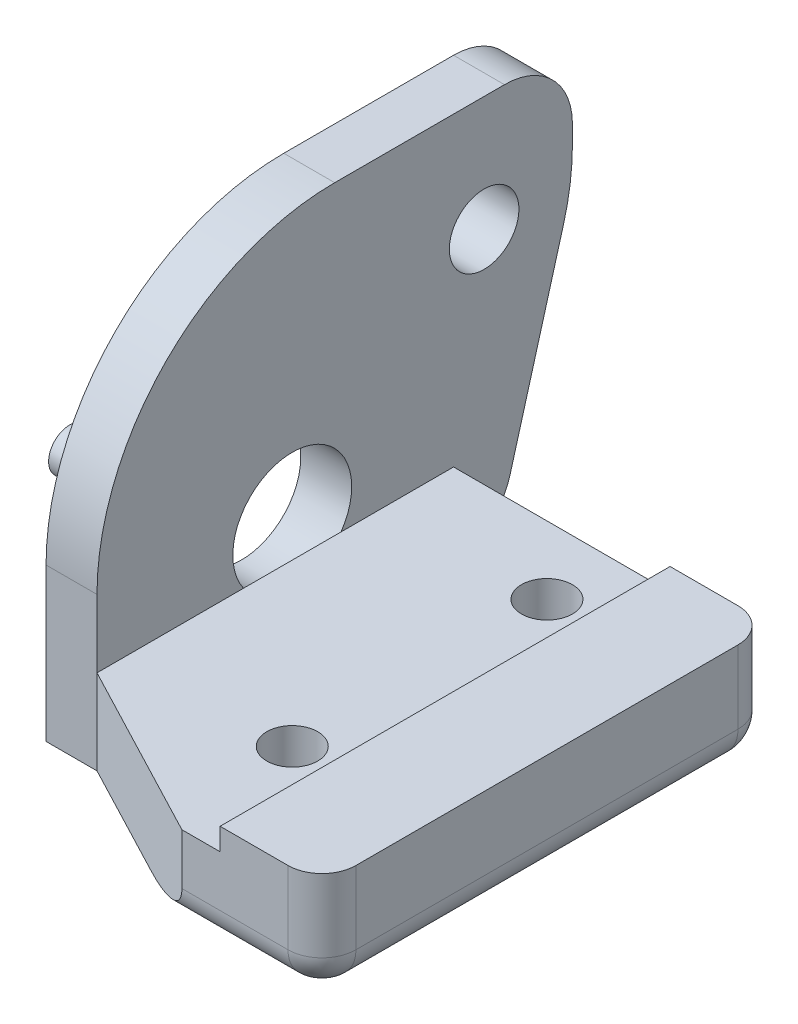
ISO-10303-21;
HEADER;
FILE_DESCRIPTION(('STEP AP214'),'2;1');
FILE_NAME('part.step','',(''),(''),'','','');
FILE_SCHEMA(('AUTOMOTIVE_DESIGN { 1 0 10303 214 1 1 1 1 }'));
ENDSEC;
DATA;
#1=APPLICATION_CONTEXT('core data for automotive mechanical design processes');
#2=APPLICATION_PROTOCOL_DEFINITION('international standard','automotive_design',2000,#1);
#3=PRODUCT_CONTEXT('',#1,'mechanical');
#4=PRODUCT('Part','Part','',(#3));
#5=PRODUCT_RELATED_PRODUCT_CATEGORY('part','',(#4));
#6=PRODUCT_DEFINITION_FORMATION('','',#4);
#7=PRODUCT_DEFINITION_CONTEXT('part definition',#1,'design');
#8=PRODUCT_DEFINITION('design','',#6,#7);
#9=PRODUCT_DEFINITION_SHAPE('','',#8);
#10=(LENGTH_UNIT() NAMED_UNIT(*) SI_UNIT(.MILLI.,.METRE.));
#11=(NAMED_UNIT(*) PLANE_ANGLE_UNIT() SI_UNIT($,.RADIAN.));
#12=(NAMED_UNIT(*) SI_UNIT($,.STERADIAN.) SOLID_ANGLE_UNIT());
#13=UNCERTAINTY_MEASURE_WITH_UNIT(LENGTH_MEASURE(1.E-05),#10,'distance_accuracy_value','');
#14=(GEOMETRIC_REPRESENTATION_CONTEXT(3) GLOBAL_UNCERTAINTY_ASSIGNED_CONTEXT((#13)) GLOBAL_UNIT_ASSIGNED_CONTEXT((#10,
#11,#12)) REPRESENTATION_CONTEXT('',''));
#15=CARTESIAN_POINT('',(0.,0.,0.));
#16=DIRECTION('',(0.,0.,1.));
#17=DIRECTION('',(1.,0.,0.));
#18=AXIS2_PLACEMENT_3D('',#15,#16,#17);
#19=CARTESIAN_POINT('',(-21.75,14.,-29.5));
#20=DIRECTION('',(-1.,0.,0.));
#21=DIRECTION('',(0.,0.,1.));
#22=AXIS2_PLACEMENT_3D('',#19,#20,#21);
#23=CYLINDRICAL_SURFACE('',#22,4.);
#24=DIRECTION('',(-1.,0.,0.));
#25=VECTOR('',#24,1.);
#26=CARTESIAN_POINT('',(-21.75,18.,-29.5));
#27=LINE('',#26,#25);
#28=CARTESIAN_POINT('',(-18.75,18.,-29.5));
#29=VERTEX_POINT('',#28);
#30=CARTESIAN_POINT('',(-21.75,18.,-29.5));
#31=VERTEX_POINT('',#30);
#32=EDGE_CURVE('E351',#29,#31,#27,.T.);
#33=ORIENTED_EDGE('',*,*,#32,.F.);
#34=CARTESIAN_POINT('',(-18.75,14.,-29.5));
#35=DIRECTION('',(1.,0.,0.));
#36=DIRECTION('',(0.,0.,-1.));
#37=AXIS2_PLACEMENT_3D('',#34,#35,#36);
#38=CIRCLE('',#37,4.);
#39=CARTESIAN_POINT('',(-18.75,14.,-33.5));
#40=VERTEX_POINT('',#39);
#41=EDGE_CURVE('E42',#40,#29,#38,.T.);
#42=ORIENTED_EDGE('',*,*,#41,.F.);
#43=DIRECTION('',(-1.,0.,0.));
#44=VECTOR('',#43,1.);
#45=CARTESIAN_POINT('',(-21.75,14.,-33.5));
#46=LINE('',#45,#44);
#47=CARTESIAN_POINT('',(-21.75,14.,-33.5));
#48=VERTEX_POINT('',#47);
#49=EDGE_CURVE('E354',#48,#40,#46,.F.);
#50=ORIENTED_EDGE('',*,*,#49,.F.);
#51=CARTESIAN_POINT('',(-21.75,14.,-29.5));
#52=DIRECTION('',(1.,0.,0.));
#53=DIRECTION('',(0.,0.,-1.));
#54=AXIS2_PLACEMENT_3D('',#51,#52,#53);
#55=CIRCLE('',#54,4.);
#56=EDGE_CURVE('E11',#31,#48,#55,.F.);
#57=ORIENTED_EDGE('',*,*,#56,.F.);
#58=EDGE_LOOP('',(#33,#42,#50,#57));
#59=FACE_BOUND('',#58,.T.);
#60=ADVANCED_FACE('F35',(#59),#23,.T.);
#61=CARTESIAN_POINT('',(0.,-5.,0.));
#62=DIRECTION('',(0.,1.,0.));
#63=DIRECTION('',(0.,0.,1.));
#64=AXIS2_PLACEMENT_3D('',#61,#62,#63);
#65=PLANE('',#64);
#66=CARTESIAN_POINT('',(-9.25,-5.,-7.5));
#67=DIRECTION('',(0.,1.,0.));
#68=DIRECTION('',(0.,0.,1.));
#69=AXIS2_PLACEMENT_3D('',#66,#67,#68);
#70=CIRCLE('',#69,1.5);
#71=CARTESIAN_POINT('',(-9.25,-5.,-6.));
#72=VERTEX_POINT('',#71);
#73=EDGE_CURVE('E236',#72,#72,#70,.T.);
#74=ORIENTED_EDGE('',*,*,#73,.T.);
#75=EDGE_LOOP('',(#74));
#76=FACE_BOUND('',#75,.T.);
#77=CARTESIAN_POINT('',(-9.25,-5.,-22.5));
#78=DIRECTION('',(0.,1.,0.));
#79=DIRECTION('',(0.,0.,1.));
#80=AXIS2_PLACEMENT_3D('',#77,#78,#79);
#81=CIRCLE('',#80,1.5);
#82=CARTESIAN_POINT('',(-9.25,-5.,-21.));
#83=VERTEX_POINT('',#82);
#84=EDGE_CURVE('E239',#83,#83,#81,.T.);
#85=ORIENTED_EDGE('',*,*,#84,.T.);
#86=EDGE_LOOP('',(#85));
#87=FACE_BOUND('',#86,.T.);
#88=DIRECTION('',(1.,0.,0.));
#89=VECTOR('',#88,1.);
#90=CARTESIAN_POINT('',(-21.75,-5.,-25.9698074653513));
#91=LINE('',#90,#89);
#92=CARTESIAN_POINT('',(-21.75,-5.,-25.9698074653513));
#93=VERTEX_POINT('',#92);
#94=CARTESIAN_POINT('',(-18.75,-5.,-25.9698074653513));
#95=VERTEX_POINT('',#94);
#96=EDGE_CURVE('E195',#93,#95,#91,.T.);
#97=ORIENTED_EDGE('',*,*,#96,.T.);
#98=DIRECTION('',(0.,0.,1.));
#99=VECTOR('',#98,1.);
#100=CARTESIAN_POINT('',(-18.75,-5.,-5.49999999999999));
#101=LINE('',#100,#99);
#102=CARTESIAN_POINT('',(-18.75,-5.,-24.5));
#103=VERTEX_POINT('',#102);
#104=EDGE_CURVE('E254',#95,#103,#101,.T.);
#105=ORIENTED_EDGE('',*,*,#104,.T.);
#106=DIRECTION('',(-1.,0.,0.));
#107=VECTOR('',#106,1.);
#108=CARTESIAN_POINT('',(0.,-5.,-24.5));
#109=LINE('',#108,#107);
#110=CARTESIAN_POINT('',(-2.,-5.,-24.5));
#111=VERTEX_POINT('',#110);
#112=EDGE_CURVE('E301',#103,#111,#109,.F.);
#113=ORIENTED_EDGE('',*,*,#112,.T.);
#114=DIRECTION('',(0.,0.,-1.));
#115=VECTOR('',#114,1.);
#116=CARTESIAN_POINT('',(-2.,-5.,0.));
#117=LINE('',#116,#115);
#118=CARTESIAN_POINT('',(-2.,-5.,-2.));
#119=VERTEX_POINT('',#118);
#120=EDGE_CURVE('E317',#111,#119,#117,.F.);
#121=ORIENTED_EDGE('',*,*,#120,.T.);
#122=DIRECTION('',(1.,0.,0.));
#123=VECTOR('',#122,1.);
#124=CARTESIAN_POINT('',(0.,-5.,-2.));
#125=LINE('',#124,#123);
#126=CARTESIAN_POINT('',(-12.0681818181818,-5.,-2.));
#127=VERTEX_POINT('',#126);
#128=EDGE_CURVE('E320',#119,#127,#125,.F.);
#129=ORIENTED_EDGE('',*,*,#128,.T.);
#130=DIRECTION('',(0.885831535280156,0.,0.464006994670557));
#131=VECTOR('',#130,1.);
#132=CARTESIAN_POINT('',(-8.25,-5.,0.));
#133=LINE('',#132,#131);
#134=CARTESIAN_POINT('',(-18.75,-5.,-5.49999999999999));
#135=VERTEX_POINT('',#134);
#136=EDGE_CURVE('E267',#135,#127,#133,.T.);
#137=ORIENTED_EDGE('',*,*,#136,.F.);
#138=DIRECTION('',(1.,0.,0.));
#139=VECTOR('',#138,1.);
#140=CARTESIAN_POINT('',(-21.75,-5.,-5.49999999999999));
#141=LINE('',#140,#139);
#142=CARTESIAN_POINT('',(-21.75,-5.,-5.49999999999999));
#143=VERTEX_POINT('',#142);
#144=EDGE_CURVE('E257',#143,#135,#141,.T.);
#145=ORIENTED_EDGE('',*,*,#144,.F.);
#146=DIRECTION('',(0.,0.,1.));
#147=VECTOR('',#146,1.);
#148=CARTESIAN_POINT('',(-21.75,-5.,-5.49999999999999));
#149=LINE('',#148,#147);
#150=EDGE_CURVE('E177',#93,#143,#149,.T.);
#151=ORIENTED_EDGE('',*,*,#150,.F.);
#152=EDGE_LOOP('',(#97,#105,#113,#121,#129,#137,#145,#151));
#153=FACE_BOUND('',#152,.T.);
#154=ADVANCED_FACE('F406',(#76,#87,#153),#65,.F.);
#155=CARTESIAN_POINT('',(-18.75,0.,0.));
#156=DIRECTION('',(1.,0.,0.));
#157=DIRECTION('',(0.,0.,-1.));
#158=AXIS2_PLACEMENT_3D('',#155,#156,#157);
#159=PLANE('',#158);
#160=DIRECTION('',(0.,-1.,0.));
#161=VECTOR('',#160,1.);
#162=CARTESIAN_POINT('',(-18.75,-5.,-33.5));
#163=LINE('',#162,#161);
#164=CARTESIAN_POINT('',(-18.75,12.9312848756278,-33.5));
#165=VERTEX_POINT('',#164);
#166=EDGE_CURVE('E193',#40,#165,#163,.T.);
#167=ORIENTED_EDGE('',*,*,#166,.F.);
#168=ORIENTED_EDGE('',*,*,#41,.T.);
#169=DIRECTION('',(0.,0.,-1.));
#170=VECTOR('',#169,1.);
#171=CARTESIAN_POINT('',(-18.75,18.,-33.5));
#172=LINE('',#171,#170);
#173=CARTESIAN_POINT('',(-18.75,18.,-19.5));
#174=VERTEX_POINT('',#173);
#175=EDGE_CURVE('E260',#174,#29,#172,.T.);
#176=ORIENTED_EDGE('',*,*,#175,.F.);
#177=CARTESIAN_POINT('',(-18.75,3.99999999999999,-19.5));
#178=DIRECTION('',(1.,0.,0.));
#179=DIRECTION('',(0.,0.,-1.));
#180=AXIS2_PLACEMENT_3D('',#177,#178,#179);
#181=CIRCLE('',#180,14.);
#182=CARTESIAN_POINT('',(-18.75,3.99999999999999,-5.49999999999999));
#183=VERTEX_POINT('',#182);
#184=EDGE_CURVE('E297',#174,#183,#181,.T.);
#185=ORIENTED_EDGE('',*,*,#184,.T.);
#186=DIRECTION('',(0.,1.,0.));
#187=VECTOR('',#186,1.);
#188=CARTESIAN_POINT('',(-18.75,18.,-5.49999999999999));
#189=LINE('',#188,#187);
#190=CARTESIAN_POINT('',(-18.75,0.,-5.49999999999999));
#191=VERTEX_POINT('',#190);
#192=EDGE_CURVE('E242',#191,#183,#189,.T.);
#193=ORIENTED_EDGE('',*,*,#192,.F.);
#194=DIRECTION('',(0.,0.,1.));
#195=VECTOR('',#194,1.);
#196=CARTESIAN_POINT('',(-18.75,0.,-26.5));
#197=LINE('',#196,#195);
#198=CARTESIAN_POINT('',(-18.75,0.,-14.127718676731));
#199=VERTEX_POINT('',#198);
#200=EDGE_CURVE('E275',#199,#191,#197,.T.);
#201=ORIENTED_EDGE('',*,*,#200,.F.);
#202=CARTESIAN_POINT('',(-18.75,2.,-17.));
#203=DIRECTION('',(1.,0.,0.));
#204=DIRECTION('',(0.,0.,-1.));
#205=AXIS2_PLACEMENT_3D('',#202,#203,#204);
#206=CIRCLE('',#205,3.5);
#207=CARTESIAN_POINT('',(-18.75,0.,-19.872281323269));
#208=VERTEX_POINT('',#207);
#209=EDGE_CURVE('E232',#208,#199,#206,.T.);
#210=ORIENTED_EDGE('',*,*,#209,.F.);
#211=CARTESIAN_POINT('',(-18.75,0.,-26.5));
#212=VERTEX_POINT('',#211);
#213=EDGE_CURVE('E276',#212,#208,#197,.T.);
#214=ORIENTED_EDGE('',*,*,#213,.F.);
#215=DIRECTION('',(0.,1.,0.));
#216=VECTOR('',#215,1.);
#217=CARTESIAN_POINT('',(-18.75,-5.,-26.5));
#218=LINE('',#217,#216);
#219=CARTESIAN_POINT('',(-18.75,-3.,-26.5));
#220=VERTEX_POINT('',#219);
#221=EDGE_CURVE('E270',#220,#212,#218,.T.);
#222=ORIENTED_EDGE('',*,*,#221,.F.);
#223=CARTESIAN_POINT('',(-18.75,-3.,-24.5));
#224=DIRECTION('',(1.,0.,0.));
#225=DIRECTION('',(0.,0.,-1.));
#226=AXIS2_PLACEMENT_3D('',#223,#224,#225);
#227=CIRCLE('',#226,2.);
#228=EDGE_CURVE('E304',#103,#220,#227,.T.);
#229=ORIENTED_EDGE('',*,*,#228,.F.);
#230=ORIENTED_EDGE('',*,*,#104,.F.);
#231=CARTESIAN_POINT('',(-18.75,-1.00000000000001,-25.9698074653513));
#232=DIRECTION('',(-1.,0.,0.));
#233=DIRECTION('',(0.,0.,1.));
#234=AXIS2_PLACEMENT_3D('',#231,#232,#233);
#235=CIRCLE('',#234,4.);
#236=CARTESIAN_POINT('',(-18.75,-2.08298230767315,-29.8204112259669));
#237=VERTEX_POINT('',#236);
#238=EDGE_CURVE('E529',#237,#95,#235,.T.);
#239=ORIENTED_EDGE('',*,*,#238,.F.);
#240=DIRECTION('',(0.,-0.962650940153899,0.270745576918286));
#241=VECTOR('',#240,1.);
#242=CARTESIAN_POINT('',(-18.75,9.1408467987718,-32.9771131621546));
#243=LINE('',#242,#241);
#244=CARTESIAN_POINT('',(-18.75,9.1408467987718,-32.9771131621546));
#245=VERTEX_POINT('',#244);
#246=EDGE_CURVE('E189',#245,#237,#243,.T.);
#247=ORIENTED_EDGE('',*,*,#246,.F.);
#248=CARTESIAN_POINT('',(-18.75,12.9312848756278,-19.5));
#249=DIRECTION('',(1.,0.,0.));
#250=DIRECTION('',(0.,0.,-1.));
#251=AXIS2_PLACEMENT_3D('',#248,#249,#250);
#252=CIRCLE('',#251,14.);
#253=EDGE_CURVE('E532',#245,#165,#252,.T.);
#254=ORIENTED_EDGE('',*,*,#253,.T.);
#255=EDGE_LOOP('',(#167,#168,#176,#185,#193,#201,#210,#214,#222,#229,#230,#239,#247,#254));
#256=FACE_BOUND('',#255,.T.);
#257=CARTESIAN_POINT('',(-18.75,11.2287565399972,-28.3));
#258=DIRECTION('',(1.,0.,0.));
#259=DIRECTION('',(0.,0.,-1.));
#260=AXIS2_PLACEMENT_3D('',#257,#258,#259);
#261=CIRCLE('',#260,2.05);
#262=CARTESIAN_POINT('',(-18.75,11.2287565399972,-30.35));
#263=VERTEX_POINT('',#262);
#264=EDGE_CURVE('E194',#263,#263,#261,.T.);
#265=ORIENTED_EDGE('',*,*,#264,.F.);
#266=EDGE_LOOP('',(#265));
#267=FACE_BOUND('',#266,.T.);
#268=ADVANCED_FACE('F357',(#256,#267),#159,.T.);
#269=CARTESIAN_POINT('',(-21.75,-5.,-33.5));
#270=DIRECTION('',(0.,0.,1.));
#271=DIRECTION('',(1.,0.,0.));
#272=AXIS2_PLACEMENT_3D('',#269,#270,#271);
#273=PLANE('',#272);
#274=DIRECTION('',(0.,-1.,0.));
#275=VECTOR('',#274,1.);
#276=CARTESIAN_POINT('',(-21.75,-5.,-33.5));
#277=LINE('',#276,#275);
#278=CARTESIAN_POINT('',(-21.75,12.9312848756278,-33.5));
#279=VERTEX_POINT('',#278);
#280=EDGE_CURVE('E170',#48,#279,#277,.T.);
#281=ORIENTED_EDGE('',*,*,#280,.F.);
#282=ORIENTED_EDGE('',*,*,#49,.T.);
#283=ORIENTED_EDGE('',*,*,#166,.T.);
#284=DIRECTION('',(1.,0.,0.));
#285=VECTOR('',#284,1.);
#286=CARTESIAN_POINT('',(-21.75,12.9312848756278,-33.5));
#287=LINE('',#286,#285);
#288=EDGE_CURVE('E184',#279,#165,#287,.T.);
#289=ORIENTED_EDGE('',*,*,#288,.F.);
#290=EDGE_LOOP('',(#281,#282,#283,#289));
#291=FACE_BOUND('',#290,.T.);
#292=ADVANCED_FACE('F191',(#291),#273,.F.);
#293=CARTESIAN_POINT('',(-21.75,0.,0.));
#294=DIRECTION('',(1.,0.,0.));
#295=DIRECTION('',(0.,0.,-1.));
#296=AXIS2_PLACEMENT_3D('',#293,#294,#295);
#297=PLANE('',#296);
#298=CARTESIAN_POINT('',(-21.75,6.2,-9.9));
#299=DIRECTION('',(1.,0.,0.));
#300=DIRECTION('',(0.,0.,-1.));
#301=AXIS2_PLACEMENT_3D('',#298,#299,#300);
#302=CIRCLE('',#301,1.25);
#303=CARTESIAN_POINT('',(-21.75,6.2,-11.15));
#304=VERTEX_POINT('',#303);
#305=EDGE_CURVE('E210',#304,#304,#302,.T.);
#306=ORIENTED_EDGE('',*,*,#305,.T.);
#307=EDGE_LOOP('',(#306));
#308=FACE_BOUND('',#307,.T.);
#309=CARTESIAN_POINT('',(-21.75,2.,-17.));
#310=DIRECTION('',(1.,0.,0.));
#311=DIRECTION('',(0.,0.,-1.));
#312=AXIS2_PLACEMENT_3D('',#309,#310,#311);
#313=CIRCLE('',#312,3.5);
#314=CARTESIAN_POINT('',(-21.75,2.,-20.5));
#315=VERTEX_POINT('',#314);
#316=EDGE_CURVE('E233',#315,#315,#313,.T.);
#317=ORIENTED_EDGE('',*,*,#316,.T.);
#318=EDGE_LOOP('',(#317));
#319=FACE_BOUND('',#318,.T.);
#320=CARTESIAN_POINT('',(-21.75,11.2287565399972,-28.3));
#321=DIRECTION('',(1.,0.,0.));
#322=DIRECTION('',(0.,0.,-1.));
#323=AXIS2_PLACEMENT_3D('',#320,#321,#322);
#324=CIRCLE('',#323,2.05);
#325=CARTESIAN_POINT('',(-21.75,11.2287565399972,-30.35));
#326=VERTEX_POINT('',#325);
#327=EDGE_CURVE('E198',#326,#326,#324,.T.);
#328=ORIENTED_EDGE('',*,*,#327,.T.);
#329=EDGE_LOOP('',(#328));
#330=FACE_BOUND('',#329,.T.);
#331=DIRECTION('',(0.,0.,-1.));
#332=VECTOR('',#331,1.);
#333=CARTESIAN_POINT('',(-21.75,18.,-33.5));
#334=LINE('',#333,#332);
#335=CARTESIAN_POINT('',(-21.75,18.,-19.5));
#336=VERTEX_POINT('',#335);
#337=EDGE_CURVE('E178',#336,#31,#334,.T.);
#338=ORIENTED_EDGE('',*,*,#337,.T.);
#339=ORIENTED_EDGE('',*,*,#56,.T.);
#340=ORIENTED_EDGE('',*,*,#280,.T.);
#341=CARTESIAN_POINT('',(-21.75,12.9312848756278,-19.5));
#342=DIRECTION('',(1.,0.,0.));
#343=DIRECTION('',(0.,0.,-1.));
#344=AXIS2_PLACEMENT_3D('',#341,#342,#343);
#345=CIRCLE('',#344,14.);
#346=CARTESIAN_POINT('',(-21.75,9.1408467987718,-32.9771131621546));
#347=VERTEX_POINT('',#346);
#348=EDGE_CURVE('E174',#347,#279,#345,.T.);
#349=ORIENTED_EDGE('',*,*,#348,.F.);
#350=DIRECTION('',(0.,-0.962650940153899,0.270745576918286));
#351=VECTOR('',#350,1.);
#352=CARTESIAN_POINT('',(-21.75,9.1408467987718,-32.9771131621546));
#353=LINE('',#352,#351);
#354=CARTESIAN_POINT('',(-21.75,-2.08298230767315,-29.8204112259669));
#355=VERTEX_POINT('',#354);
#356=EDGE_CURVE('E537',#347,#355,#353,.T.);
#357=ORIENTED_EDGE('',*,*,#356,.T.);
#358=CARTESIAN_POINT('',(-21.75,-1.00000000000001,-25.9698074653513));
#359=DIRECTION('',(-1.,0.,0.));
#360=DIRECTION('',(0.,0.,1.));
#361=AXIS2_PLACEMENT_3D('',#358,#359,#360);
#362=CIRCLE('',#361,4.);
#363=EDGE_CURVE('E188',#355,#93,#362,.T.);
#364=ORIENTED_EDGE('',*,*,#363,.T.);
#365=ORIENTED_EDGE('',*,*,#150,.T.);
#366=DIRECTION('',(0.,1.,0.));
#367=VECTOR('',#366,1.);
#368=CARTESIAN_POINT('',(-21.75,18.,-5.49999999999999));
#369=LINE('',#368,#367);
#370=CARTESIAN_POINT('',(-21.75,3.99999999999999,-5.49999999999999));
#371=VERTEX_POINT('',#370);
#372=EDGE_CURVE('E251',#143,#371,#369,.T.);
#373=ORIENTED_EDGE('',*,*,#372,.T.);
#374=CARTESIAN_POINT('',(-21.75,3.99999999999999,-19.5));
#375=DIRECTION('',(1.,0.,0.));
#376=DIRECTION('',(0.,0.,-1.));
#377=AXIS2_PLACEMENT_3D('',#374,#375,#376);
#378=CIRCLE('',#377,14.);
#379=EDGE_CURVE('E295',#371,#336,#378,.F.);
#380=ORIENTED_EDGE('',*,*,#379,.T.);
#381=EDGE_LOOP('',(#338,#339,#340,#349,#357,#364,#365,#373,#380));
#382=FACE_BOUND('',#381,.T.);
#383=ADVANCED_FACE('F172',(#308,#319,#330,#382),#297,.F.);
#384=CARTESIAN_POINT('',(-2.,-3.,-24.5));
#385=DIRECTION('',(1.,0.,0.));
#386=DIRECTION('',(0.,0.,-1.));
#387=AXIS2_PLACEMENT_3D('',#384,#385,#386);
#388=SPHERICAL_SURFACE('',#387,2.);
#389=CARTESIAN_POINT('',(-2.,-3.,-24.5));
#390=DIRECTION('',(0.,1.,0.));
#391=DIRECTION('',(0.,0.,1.));
#392=AXIS2_PLACEMENT_3D('',#389,#390,#391);
#393=CIRCLE('',#392,2.);
#394=CARTESIAN_POINT('',(0.,-3.,-24.5));
#395=VERTEX_POINT('',#394);
#396=CARTESIAN_POINT('',(-2.,-3.,-26.5));
#397=VERTEX_POINT('',#396);
#398=EDGE_CURVE('E349',#395,#397,#393,.T.);
#399=ORIENTED_EDGE('',*,*,#398,.F.);
#400=CARTESIAN_POINT('',(-2.,-3.,-24.5));
#401=DIRECTION('',(0.,0.,-1.));
#402=DIRECTION('',(-1.,0.,0.));
#403=AXIS2_PLACEMENT_3D('',#400,#401,#402);
#404=CIRCLE('',#403,2.);
#405=EDGE_CURVE('E347',#395,#111,#404,.T.);
#406=ORIENTED_EDGE('',*,*,#405,.T.);
#407=CARTESIAN_POINT('',(-2.,-3.,-24.5));
#408=DIRECTION('',(1.,0.,0.));
#409=DIRECTION('',(0.,0.,-1.));
#410=AXIS2_PLACEMENT_3D('',#407,#408,#409);
#411=CIRCLE('',#410,2.);
#412=EDGE_CURVE('E334',#397,#111,#411,.F.);
#413=ORIENTED_EDGE('',*,*,#412,.F.);
#414=EDGE_LOOP('',(#399,#406,#413));
#415=FACE_BOUND('',#414,.T.);
#416=ADVANCED_FACE('F462',(#415),#388,.T.);
#417=CARTESIAN_POINT('',(-2.,-3.,0.));
#418=DIRECTION('',(0.,0.,1.));
#419=DIRECTION('',(1.,0.,0.));
#420=AXIS2_PLACEMENT_3D('',#417,#418,#419);
#421=CYLINDRICAL_SURFACE('',#420,2.);
#422=ORIENTED_EDGE('',*,*,#405,.F.);
#423=DIRECTION('',(0.,0.,-1.));
#424=VECTOR('',#423,1.);
#425=CARTESIAN_POINT('',(0.,-3.,0.));
#426=LINE('',#425,#424);
#427=CARTESIAN_POINT('',(0.,-3.,-2.));
#428=VERTEX_POINT('',#427);
#429=EDGE_CURVE('E331',#428,#395,#426,.T.);
#430=ORIENTED_EDGE('',*,*,#429,.F.);
#431=CARTESIAN_POINT('',(-2.,-3.,-2.));
#432=DIRECTION('',(0.,0.,-1.));
#433=DIRECTION('',(-1.,0.,0.));
#434=AXIS2_PLACEMENT_3D('',#431,#432,#433);
#435=CIRCLE('',#434,2.);
#436=EDGE_CURVE('E345',#428,#119,#435,.T.);
#437=ORIENTED_EDGE('',*,*,#436,.T.);
#438=ORIENTED_EDGE('',*,*,#120,.F.);
#439=EDGE_LOOP('',(#422,#430,#437,#438));
#440=FACE_BOUND('',#439,.T.);
#441=ADVANCED_FACE('F458',(#440),#421,.T.);
#442=CARTESIAN_POINT('',(-2.,-3.,-2.));
#443=DIRECTION('',(0.,1.,0.));
#444=DIRECTION('',(0.,0.,1.));
#445=AXIS2_PLACEMENT_3D('',#442,#443,#444);
#446=SPHERICAL_SURFACE('',#445,2.);
#447=ORIENTED_EDGE('',*,*,#436,.F.);
#448=CARTESIAN_POINT('',(-2.,-3.,-2.));
#449=DIRECTION('',(0.,1.,0.));
#450=DIRECTION('',(0.,0.,1.));
#451=AXIS2_PLACEMENT_3D('',#448,#449,#450);
#452=CIRCLE('',#451,2.);
#453=CARTESIAN_POINT('',(-2.,-3.,0.));
#454=VERTEX_POINT('',#453);
#455=EDGE_CURVE('E325',#454,#428,#452,.T.);
#456=ORIENTED_EDGE('',*,*,#455,.F.);
#457=CARTESIAN_POINT('',(-2.,-3.,-2.));
#458=DIRECTION('',(1.,0.,0.));
#459=DIRECTION('',(0.,0.,-1.));
#460=AXIS2_PLACEMENT_3D('',#457,#458,#459);
#461=CIRCLE('',#460,2.);
#462=EDGE_CURVE('E342',#454,#119,#461,.T.);
#463=ORIENTED_EDGE('',*,*,#462,.T.);
#464=EDGE_LOOP('',(#447,#456,#463));
#465=FACE_BOUND('',#464,.T.);
#466=ADVANCED_FACE('F454',(#465),#446,.T.);
#467=CARTESIAN_POINT('',(0.,-3.,-2.));
#468=DIRECTION('',(-1.,0.,0.));
#469=DIRECTION('',(0.,0.,1.));
#470=AXIS2_PLACEMENT_3D('',#467,#468,#469);
#471=CYLINDRICAL_SURFACE('',#470,2.);
#472=ORIENTED_EDGE('',*,*,#462,.F.);
#473=DIRECTION('',(1.,0.,0.));
#474=VECTOR('',#473,1.);
#475=CARTESIAN_POINT('',(0.,-3.,0.));
#476=LINE('',#475,#474);
#477=CARTESIAN_POINT('',(-8.25,-3.,0.));
#478=VERTEX_POINT('',#477);
#479=EDGE_CURVE('E314',#478,#454,#476,.T.);
#480=ORIENTED_EDGE('',*,*,#479,.F.);
#481=CARTESIAN_POINT('',(-12.0681818181818,-3.,-2.));
#482=DIRECTION('',(-0.464006994670557,0.,0.885831535280156));
#483=DIRECTION('',(-0.885831535280156,0.,-0.464006994670557));
#484=AXIS2_PLACEMENT_3D('',#481,#482,#483);
#485=ELLIPSE('',#484,4.31027985131989,2.);
#486=EDGE_CURVE('E323',#127,#478,#485,.T.);
#487=ORIENTED_EDGE('',*,*,#486,.F.);
#488=ORIENTED_EDGE('',*,*,#128,.F.);
#489=EDGE_LOOP('',(#472,#480,#487,#488));
#490=FACE_BOUND('',#489,.T.);
#491=ADVANCED_FACE('F451',(#490),#471,.T.);
#492=CARTESIAN_POINT('',(-2.,-5.,-24.5));
#493=DIRECTION('',(0.,1.,0.));
#494=DIRECTION('',(0.,0.,1.));
#495=AXIS2_PLACEMENT_3D('',#492,#493,#494);
#496=CYLINDRICAL_SURFACE('',#495,2.);
#497=DIRECTION('',(0.,1.,0.));
#498=VECTOR('',#497,1.);
#499=CARTESIAN_POINT('',(0.,-5.,-24.5));
#500=LINE('',#499,#498);
#501=CARTESIAN_POINT('',(0.,1.3,-24.5));
#502=VERTEX_POINT('',#501);
#503=EDGE_CURVE('E328',#395,#502,#500,.T.);
#504=ORIENTED_EDGE('',*,*,#503,.F.);
#505=ORIENTED_EDGE('',*,*,#398,.T.);
#506=DIRECTION('',(0.,1.,0.));
#507=VECTOR('',#506,1.);
#508=CARTESIAN_POINT('',(-2.,-5.,-26.5));
#509=LINE('',#508,#507);
#510=CARTESIAN_POINT('',(-2.,1.3,-26.5));
#511=VERTEX_POINT('',#510);
#512=EDGE_CURVE('E337',#511,#397,#509,.F.);
#513=ORIENTED_EDGE('',*,*,#512,.F.);
#514=CARTESIAN_POINT('',(-2.,1.3,-24.5));
#515=DIRECTION('',(0.,1.,0.));
#516=DIRECTION('',(0.,0.,1.));
#517=AXIS2_PLACEMENT_3D('',#514,#515,#516);
#518=CIRCLE('',#517,2.);
#519=EDGE_CURVE('E340',#502,#511,#518,.T.);
#520=ORIENTED_EDGE('',*,*,#519,.F.);
#521=EDGE_LOOP('',(#504,#505,#513,#520));
#522=FACE_BOUND('',#521,.T.);
#523=ADVANCED_FACE('F449',(#522),#496,.T.);
#524=CARTESIAN_POINT('',(-2.,-5.,-2.));
#525=DIRECTION('',(0.,1.,0.));
#526=DIRECTION('',(0.,0.,1.));
#527=AXIS2_PLACEMENT_3D('',#524,#525,#526);
#528=CYLINDRICAL_SURFACE('',#527,2.);
#529=DIRECTION('',(0.,1.,0.));
#530=VECTOR('',#529,1.);
#531=CARTESIAN_POINT('',(-2.,-5.,0.));
#532=LINE('',#531,#530);
#533=CARTESIAN_POINT('',(-2.,1.3,0.));
#534=VERTEX_POINT('',#533);
#535=EDGE_CURVE('E307',#454,#534,#532,.T.);
#536=ORIENTED_EDGE('',*,*,#535,.F.);
#537=ORIENTED_EDGE('',*,*,#455,.T.);
#538=DIRECTION('',(0.,1.,0.));
#539=VECTOR('',#538,1.);
#540=CARTESIAN_POINT('',(0.,-5.,-2.));
#541=LINE('',#540,#539);
#542=CARTESIAN_POINT('',(0.,1.3,-2.));
#543=VERTEX_POINT('',#542);
#544=EDGE_CURVE('E309',#543,#428,#541,.F.);
#545=ORIENTED_EDGE('',*,*,#544,.F.);
#546=CARTESIAN_POINT('',(-2.,1.3,-2.));
#547=DIRECTION('',(0.,1.,0.));
#548=DIRECTION('',(0.,0.,1.));
#549=AXIS2_PLACEMENT_3D('',#546,#547,#548);
#550=CIRCLE('',#549,2.);
#551=EDGE_CURVE('E312',#534,#543,#550,.T.);
#552=ORIENTED_EDGE('',*,*,#551,.F.);
#553=EDGE_LOOP('',(#536,#537,#545,#552));
#554=FACE_BOUND('',#553,.T.);
#555=ADVANCED_FACE('F426',(#554),#528,.T.);
#556=CARTESIAN_POINT('',(0.,0.,0.));
#557=DIRECTION('',(0.,1.,0.));
#558=DIRECTION('',(0.,0.,1.));
#559=AXIS2_PLACEMENT_3D('',#556,#557,#558);
#560=PLANE('',#559);
#561=CARTESIAN_POINT('',(-9.25,0.,-22.5));
#562=DIRECTION('',(0.,1.,0.));
#563=DIRECTION('',(0.,0.,1.));
#564=AXIS2_PLACEMENT_3D('',#561,#562,#563);
#565=CIRCLE('',#564,1.5);
#566=CARTESIAN_POINT('',(-9.25,0.,-21.));
#567=VERTEX_POINT('',#566);
#568=EDGE_CURVE('E243',#567,#567,#565,.T.);
#569=ORIENTED_EDGE('',*,*,#568,.F.);
#570=EDGE_LOOP('',(#569));
#571=FACE_BOUND('',#570,.T.);
#572=CARTESIAN_POINT('',(-9.25,0.,-7.5));
#573=DIRECTION('',(0.,1.,0.));
#574=DIRECTION('',(0.,0.,1.));
#575=AXIS2_PLACEMENT_3D('',#572,#573,#574);
#576=CIRCLE('',#575,1.5);
#577=CARTESIAN_POINT('',(-9.25,0.,-6.));
#578=VERTEX_POINT('',#577);
#579=EDGE_CURVE('E246',#578,#578,#576,.T.);
#580=ORIENTED_EDGE('',*,*,#579,.F.);
#581=EDGE_LOOP('',(#580));
#582=FACE_BOUND('',#581,.T.);
#583=DIRECTION('',(1.,0.,0.));
#584=VECTOR('',#583,1.);
#585=CARTESIAN_POINT('',(0.,0.,0.));
#586=LINE('',#585,#584);
#587=CARTESIAN_POINT('',(-8.25,0.,0.));
#588=VERTEX_POINT('',#587);
#589=CARTESIAN_POINT('',(-6.,0.,0.));
#590=VERTEX_POINT('',#589);
#591=EDGE_CURVE('E266',#588,#590,#586,.T.);
#592=ORIENTED_EDGE('',*,*,#591,.T.);
#593=DIRECTION('',(0.,0.,1.));
#594=VECTOR('',#593,1.);
#595=CARTESIAN_POINT('',(-6.,0.,-26.5));
#596=LINE('',#595,#594);
#597=CARTESIAN_POINT('',(-6.,0.,-26.5));
#598=VERTEX_POINT('',#597);
#599=EDGE_CURVE('E213',#598,#590,#596,.T.);
#600=ORIENTED_EDGE('',*,*,#599,.F.);
#601=DIRECTION('',(-1.,0.,0.));
#602=VECTOR('',#601,1.);
#603=CARTESIAN_POINT('',(0.,0.,-26.5));
#604=LINE('',#603,#602);
#605=EDGE_CURVE('E273',#598,#212,#604,.T.);
#606=ORIENTED_EDGE('',*,*,#605,.T.);
#607=ORIENTED_EDGE('',*,*,#213,.T.);
#608=EDGE_CURVE('E279',#208,#199,#197,.T.);
#609=ORIENTED_EDGE('',*,*,#608,.T.);
#610=ORIENTED_EDGE('',*,*,#200,.T.);
#611=DIRECTION('',(0.885831535280156,0.,0.464006994670557));
#612=VECTOR('',#611,1.);
#613=CARTESIAN_POINT('',(-8.25,0.,0.));
#614=LINE('',#613,#612);
#615=EDGE_CURVE('E271',#191,#588,#614,.T.);
#616=ORIENTED_EDGE('',*,*,#615,.T.);
#617=EDGE_LOOP('',(#592,#600,#606,#607,#609,#610,#616));
#618=FACE_BOUND('',#617,.T.);
#619=ADVANCED_FACE('F382',(#571,#582,#618),#560,.T.);
#620=CARTESIAN_POINT('',(0.,-3.,-24.5));
#621=DIRECTION('',(1.,0.,0.));
#622=DIRECTION('',(0.,0.,-1.));
#623=AXIS2_PLACEMENT_3D('',#620,#621,#622);
#624=CYLINDRICAL_SURFACE('',#623,2.);
#625=DIRECTION('',(-1.,0.,0.));
#626=VECTOR('',#625,1.);
#627=CARTESIAN_POINT('',(0.,-3.,-26.5));
#628=LINE('',#627,#626);
#629=EDGE_CURVE('E299',#397,#220,#628,.T.);
#630=ORIENTED_EDGE('',*,*,#629,.F.);
#631=ORIENTED_EDGE('',*,*,#412,.T.);
#632=ORIENTED_EDGE('',*,*,#112,.F.);
#633=ORIENTED_EDGE('',*,*,#228,.T.);
#634=EDGE_LOOP('',(#630,#631,#632,#633));
#635=FACE_BOUND('',#634,.T.);
#636=ADVANCED_FACE('F425',(#635),#624,.T.);
#637=CARTESIAN_POINT('',(-21.75,3.99999999999999,-19.5));
#638=DIRECTION('',(1.,0.,0.));
#639=DIRECTION('',(0.,0.,-1.));
#640=AXIS2_PLACEMENT_3D('',#637,#638,#639);
#641=CYLINDRICAL_SURFACE('',#640,14.);
#642=DIRECTION('',(1.,0.,0.));
#643=VECTOR('',#642,1.);
#644=CARTESIAN_POINT('',(-21.75,18.,-19.5));
#645=LINE('',#644,#643);
#646=EDGE_CURVE('E284',#336,#174,#645,.T.);
#647=ORIENTED_EDGE('',*,*,#646,.F.);
#648=ORIENTED_EDGE('',*,*,#379,.F.);
#649=DIRECTION('',(1.,0.,0.));
#650=VECTOR('',#649,1.);
#651=CARTESIAN_POINT('',(-21.75,3.99999999999999,-5.49999999999999));
#652=LINE('',#651,#650);
#653=EDGE_CURVE('E292',#183,#371,#652,.F.);
#654=ORIENTED_EDGE('',*,*,#653,.F.);
#655=ORIENTED_EDGE('',*,*,#184,.F.);
#656=EDGE_LOOP('',(#647,#648,#654,#655));
#657=FACE_BOUND('',#656,.T.);
#658=ADVANCED_FACE('F364',(#657),#641,.T.);
#659=CARTESIAN_POINT('',(0.,-5.,0.));
#660=DIRECTION('',(0.,0.,1.));
#661=DIRECTION('',(1.,0.,0.));
#662=AXIS2_PLACEMENT_3D('',#659,#660,#661);
#663=PLANE('',#662);
#664=DIRECTION('',(0.,1.,0.));
#665=VECTOR('',#664,1.);
#666=CARTESIAN_POINT('',(-8.25,-5.,0.));
#667=LINE('',#666,#665);
#668=EDGE_CURVE('E282',#478,#588,#667,.T.);
#669=ORIENTED_EDGE('',*,*,#668,.F.);
#670=ORIENTED_EDGE('',*,*,#479,.T.);
#671=ORIENTED_EDGE('',*,*,#535,.T.);
#672=DIRECTION('',(1.,0.,0.));
#673=VECTOR('',#672,1.);
#674=CARTESIAN_POINT('',(-6.,1.3,0.));
#675=LINE('',#674,#673);
#676=CARTESIAN_POINT('',(-6.,1.3,0.));
#677=VERTEX_POINT('',#676);
#678=EDGE_CURVE('E221',#677,#534,#675,.T.);
#679=ORIENTED_EDGE('',*,*,#678,.F.);
#680=DIRECTION('',(0.,-1.,0.));
#681=VECTOR('',#680,1.);
#682=CARTESIAN_POINT('',(-6.,1.3,0.));
#683=LINE('',#682,#681);
#684=EDGE_CURVE('E224',#677,#590,#683,.T.);
#685=ORIENTED_EDGE('',*,*,#684,.T.);
#686=ORIENTED_EDGE('',*,*,#591,.F.);
#687=EDGE_LOOP('',(#669,#670,#671,#679,#685,#686));
#688=FACE_BOUND('',#687,.T.);
#689=ADVANCED_FACE('F431',(#688),#663,.T.);
#690=CARTESIAN_POINT('',(-8.25,-5.,0.));
#691=DIRECTION('',(-0.464006994670557,0.,0.885831535280156));
#692=DIRECTION('',(0.885831535280156,0.,0.464006994670557));
#693=AXIS2_PLACEMENT_3D('',#690,#691,#692);
#694=PLANE('',#693);
#695=ORIENTED_EDGE('',*,*,#136,.T.);
#696=ORIENTED_EDGE('',*,*,#486,.T.);
#697=ORIENTED_EDGE('',*,*,#668,.T.);
#698=ORIENTED_EDGE('',*,*,#615,.F.);
#699=DIRECTION('',(0.,1.,0.));
#700=VECTOR('',#699,1.);
#701=CARTESIAN_POINT('',(-18.75,-5.,-5.49999999999999));
#702=LINE('',#701,#700);
#703=EDGE_CURVE('E285',#135,#191,#702,.T.);
#704=ORIENTED_EDGE('',*,*,#703,.F.);
#705=EDGE_LOOP('',(#695,#696,#697,#698,#704));
#706=FACE_BOUND('',#705,.T.);
#707=ADVANCED_FACE('F378',(#706),#694,.T.);
#708=CARTESIAN_POINT('',(0.,-5.,-26.5));
#709=DIRECTION('',(0.,0.,-1.));
#710=DIRECTION('',(-1.,0.,0.));
#711=AXIS2_PLACEMENT_3D('',#708,#709,#710);
#712=PLANE('',#711);
#713=DIRECTION('',(-1.,0.,0.));
#714=VECTOR('',#713,1.);
#715=CARTESIAN_POINT('',(0.,1.3,-26.5));
#716=LINE('',#715,#714);
#717=CARTESIAN_POINT('',(-6.,1.3,-26.5));
#718=VERTEX_POINT('',#717);
#719=EDGE_CURVE('E217',#511,#718,#716,.T.);
#720=ORIENTED_EDGE('',*,*,#719,.F.);
#721=ORIENTED_EDGE('',*,*,#512,.T.);
#722=ORIENTED_EDGE('',*,*,#629,.T.);
#723=ORIENTED_EDGE('',*,*,#221,.T.);
#724=ORIENTED_EDGE('',*,*,#605,.F.);
#725=DIRECTION('',(0.,-1.,0.));
#726=VECTOR('',#725,1.);
#727=CARTESIAN_POINT('',(-6.,1.3,-26.5));
#728=LINE('',#727,#726);
#729=EDGE_CURVE('E229',#718,#598,#728,.T.);
#730=ORIENTED_EDGE('',*,*,#729,.F.);
#731=EDGE_LOOP('',(#720,#721,#722,#723,#724,#730));
#732=FACE_BOUND('',#731,.T.);
#733=ADVANCED_FACE('F430',(#732),#712,.T.);
#734=CARTESIAN_POINT('',(0.,-5.,0.));
#735=DIRECTION('',(1.,0.,0.));
#736=DIRECTION('',(0.,0.,-1.));
#737=AXIS2_PLACEMENT_3D('',#734,#735,#736);
#738=PLANE('',#737);
#739=ORIENTED_EDGE('',*,*,#544,.T.);
#740=ORIENTED_EDGE('',*,*,#429,.T.);
#741=ORIENTED_EDGE('',*,*,#503,.T.);
#742=DIRECTION('',(0.,0.,-1.));
#743=VECTOR('',#742,1.);
#744=CARTESIAN_POINT('',(0.,1.3,0.));
#745=LINE('',#744,#743);
#746=EDGE_CURVE('E214',#543,#502,#745,.T.);
#747=ORIENTED_EDGE('',*,*,#746,.F.);
#748=EDGE_LOOP('',(#739,#740,#741,#747));
#749=FACE_BOUND('',#748,.T.);
#750=ADVANCED_FACE('F434',(#749),#738,.T.);
#751=CARTESIAN_POINT('',(-21.75,18.,-5.49999999999999));
#752=DIRECTION('',(0.,0.,-1.));
#753=DIRECTION('',(-1.,0.,0.));
#754=AXIS2_PLACEMENT_3D('',#751,#752,#753);
#755=PLANE('',#754);
#756=ORIENTED_EDGE('',*,*,#192,.T.);
#757=ORIENTED_EDGE('',*,*,#653,.T.);
#758=ORIENTED_EDGE('',*,*,#372,.F.);
#759=ORIENTED_EDGE('',*,*,#144,.T.);
#760=ORIENTED_EDGE('',*,*,#703,.T.);
#761=EDGE_LOOP('',(#756,#757,#758,#759,#760));
#762=FACE_BOUND('',#761,.T.);
#763=ADVANCED_FACE('F373',(#762),#755,.F.);
#764=CARTESIAN_POINT('',(-21.75,18.,-33.5));
#765=DIRECTION('',(0.,-1.,0.));
#766=DIRECTION('',(0.,0.,-1.));
#767=AXIS2_PLACEMENT_3D('',#764,#765,#766);
#768=PLANE('',#767);
#769=ORIENTED_EDGE('',*,*,#175,.T.);
#770=ORIENTED_EDGE('',*,*,#32,.T.);
#771=ORIENTED_EDGE('',*,*,#337,.F.);
#772=ORIENTED_EDGE('',*,*,#646,.T.);
#773=EDGE_LOOP('',(#769,#770,#771,#772));
#774=FACE_BOUND('',#773,.T.);
#775=ADVANCED_FACE('F361',(#774),#768,.F.);
#776=CARTESIAN_POINT('',(-9.25,-5.,-7.5));
#777=DIRECTION('',(0.,1.,0.));
#778=DIRECTION('',(0.,0.,1.));
#779=AXIS2_PLACEMENT_3D('',#776,#777,#778);
#780=CYLINDRICAL_SURFACE('',#779,1.5);
#781=ORIENTED_EDGE('',*,*,#73,.F.);
#782=EDGE_LOOP('',(#781));
#783=FACE_BOUND('',#782,.T.);
#784=ORIENTED_EDGE('',*,*,#579,.T.);
#785=EDGE_LOOP('',(#784));
#786=FACE_BOUND('',#785,.T.);
#787=ADVANCED_FACE('F401',(#783,#786),#780,.F.);
#788=CARTESIAN_POINT('',(-9.25,-5.,-22.5));
#789=DIRECTION('',(0.,1.,0.));
#790=DIRECTION('',(0.,0.,1.));
#791=AXIS2_PLACEMENT_3D('',#788,#789,#790);
#792=CYLINDRICAL_SURFACE('',#791,1.5);
#793=ORIENTED_EDGE('',*,*,#84,.F.);
#794=EDGE_LOOP('',(#793));
#795=FACE_BOUND('',#794,.T.);
#796=ORIENTED_EDGE('',*,*,#568,.T.);
#797=EDGE_LOOP('',(#796));
#798=FACE_BOUND('',#797,.T.);
#799=ADVANCED_FACE('F392',(#795,#798),#792,.F.);
#800=CARTESIAN_POINT('',(-21.75,2.,-17.));
#801=DIRECTION('',(1.,0.,0.));
#802=DIRECTION('',(0.,0.,-1.));
#803=AXIS2_PLACEMENT_3D('',#800,#801,#802);
#804=CYLINDRICAL_SURFACE('',#803,3.5);
#805=ORIENTED_EDGE('',*,*,#316,.F.);
#806=EDGE_LOOP('',(#805));
#807=FACE_BOUND('',#806,.T.);
#808=EDGE_CURVE('E237',#199,#208,#206,.T.);
#809=ORIENTED_EDGE('',*,*,#808,.T.);
#810=ORIENTED_EDGE('',*,*,#209,.T.);
#811=EDGE_LOOP('',(#809,#810));
#812=FACE_BOUND('',#811,.T.);
#813=ADVANCED_FACE('F390',(#807,#812),#804,.F.);
#814=CARTESIAN_POINT('',(-18.75,2.,-17.));
#815=DIRECTION('',(1.,0.,0.));
#816=DIRECTION('',(0.,0.,-1.));
#817=AXIS2_PLACEMENT_3D('',#814,#815,#816);
#818=PLANE('',#817);
#819=ORIENTED_EDGE('',*,*,#608,.F.);
#820=ORIENTED_EDGE('',*,*,#808,.F.);
#821=EDGE_LOOP('',(#819,#820));
#822=FACE_BOUND('',#821,.T.);
#823=ADVANCED_FACE('F387',(#822),#818,.F.);
#824=CARTESIAN_POINT('',(-6.,1.3,-26.5));
#825=DIRECTION('',(1.,0.,0.));
#826=DIRECTION('',(0.,0.,-1.));
#827=AXIS2_PLACEMENT_3D('',#824,#825,#826);
#828=PLANE('',#827);
#829=ORIENTED_EDGE('',*,*,#599,.T.);
#830=ORIENTED_EDGE('',*,*,#684,.F.);
#831=DIRECTION('',(0.,0.,1.));
#832=VECTOR('',#831,1.);
#833=CARTESIAN_POINT('',(-6.,1.3,-26.5));
#834=LINE('',#833,#832);
#835=EDGE_CURVE('E219',#718,#677,#834,.T.);
#836=ORIENTED_EDGE('',*,*,#835,.F.);
#837=ORIENTED_EDGE('',*,*,#729,.T.);
#838=EDGE_LOOP('',(#829,#830,#836,#837));
#839=FACE_BOUND('',#838,.T.);
#840=ADVANCED_FACE('F399',(#839),#828,.F.);
#841=CARTESIAN_POINT('',(0.,1.3,0.));
#842=DIRECTION('',(0.,1.,0.));
#843=DIRECTION('',(0.,0.,1.));
#844=AXIS2_PLACEMENT_3D('',#841,#842,#843);
#845=PLANE('',#844);
#846=ORIENTED_EDGE('',*,*,#746,.T.);
#847=ORIENTED_EDGE('',*,*,#519,.T.);
#848=ORIENTED_EDGE('',*,*,#719,.T.);
#849=ORIENTED_EDGE('',*,*,#835,.T.);
#850=ORIENTED_EDGE('',*,*,#678,.T.);
#851=ORIENTED_EDGE('',*,*,#551,.T.);
#852=EDGE_LOOP('',(#846,#847,#848,#849,#850,#851));
#853=FACE_BOUND('',#852,.T.);
#854=ADVANCED_FACE('F475',(#853),#845,.T.);
#855=CARTESIAN_POINT('',(-24.75,6.2,-9.9));
#856=DIRECTION('',(1.,0.,0.));
#857=DIRECTION('',(0.,0.,-1.));
#858=AXIS2_PLACEMENT_3D('',#855,#856,#857);
#859=CYLINDRICAL_SURFACE('',#858,1.25);
#860=CARTESIAN_POINT('',(-24.75,6.2,-9.9));
#861=DIRECTION('',(1.,0.,0.));
#862=DIRECTION('',(0.,0.,-1.));
#863=AXIS2_PLACEMENT_3D('',#860,#861,#862);
#864=CIRCLE('',#863,1.25);
#865=CARTESIAN_POINT('',(-24.75,6.2,-11.15));
#866=VERTEX_POINT('',#865);
#867=EDGE_CURVE('E206',#866,#866,#864,.T.);
#868=ORIENTED_EDGE('',*,*,#867,.T.);
#869=EDGE_LOOP('',(#868));
#870=FACE_BOUND('',#869,.T.);
#871=ORIENTED_EDGE('',*,*,#305,.F.);
#872=EDGE_LOOP('',(#871));
#873=FACE_BOUND('',#872,.T.);
#874=ADVANCED_FACE('F501',(#870,#873),#859,.T.);
#875=CARTESIAN_POINT('',(-24.75,6.2,-9.9));
#876=DIRECTION('',(1.,0.,0.));
#877=DIRECTION('',(0.,0.,-1.));
#878=AXIS2_PLACEMENT_3D('',#875,#876,#877);
#879=PLANE('',#878);
#880=ORIENTED_EDGE('',*,*,#867,.F.);
#881=EDGE_LOOP('',(#880));
#882=FACE_BOUND('',#881,.T.);
#883=ADVANCED_FACE('F506',(#882),#879,.F.);
#884=CARTESIAN_POINT('',(-21.75,11.2287565399972,-28.3));
#885=DIRECTION('',(1.,0.,0.));
#886=DIRECTION('',(0.,0.,-1.));
#887=AXIS2_PLACEMENT_3D('',#884,#885,#886);
#888=CYLINDRICAL_SURFACE('',#887,2.05);
#889=ORIENTED_EDGE('',*,*,#327,.F.);
#890=EDGE_LOOP('',(#889));
#891=FACE_BOUND('',#890,.T.);
#892=ORIENTED_EDGE('',*,*,#264,.T.);
#893=EDGE_LOOP('',(#892));
#894=FACE_BOUND('',#893,.T.);
#895=ADVANCED_FACE('F510',(#891,#894),#888,.F.);
#896=CARTESIAN_POINT('',(-21.75,12.9312848756278,-19.5));
#897=DIRECTION('',(1.,0.,0.));
#898=DIRECTION('',(0.,0.,-1.));
#899=AXIS2_PLACEMENT_3D('',#896,#897,#898);
#900=CYLINDRICAL_SURFACE('',#899,14.);
#901=ORIENTED_EDGE('',*,*,#253,.F.);
#902=DIRECTION('',(1.,0.,0.));
#903=VECTOR('',#902,1.);
#904=CARTESIAN_POINT('',(-21.75,9.1408467987718,-32.9771131621546));
#905=LINE('',#904,#903);
#906=EDGE_CURVE('E186',#347,#245,#905,.T.);
#907=ORIENTED_EDGE('',*,*,#906,.F.);
#908=ORIENTED_EDGE('',*,*,#348,.T.);
#909=ORIENTED_EDGE('',*,*,#288,.T.);
#910=EDGE_LOOP('',(#901,#907,#908,#909));
#911=FACE_BOUND('',#910,.T.);
#912=ADVANCED_FACE('F183',(#911),#900,.T.);
#913=CARTESIAN_POINT('',(-21.75,-1.00000000000001,-25.9698074653513));
#914=DIRECTION('',(1.,0.,0.));
#915=DIRECTION('',(0.,0.,-1.));
#916=AXIS2_PLACEMENT_3D('',#913,#914,#915);
#917=CYLINDRICAL_SURFACE('',#916,4.);
#918=ORIENTED_EDGE('',*,*,#238,.T.);
#919=ORIENTED_EDGE('',*,*,#96,.F.);
#920=ORIENTED_EDGE('',*,*,#363,.F.);
#921=DIRECTION('',(1.,0.,0.));
#922=VECTOR('',#921,1.);
#923=CARTESIAN_POINT('',(-21.75,-2.08298230767315,-29.8204112259669));
#924=LINE('',#923,#922);
#925=EDGE_CURVE('E201',#355,#237,#924,.T.);
#926=ORIENTED_EDGE('',*,*,#925,.T.);
#927=EDGE_LOOP('',(#918,#919,#920,#926));
#928=FACE_BOUND('',#927,.T.);
#929=ADVANCED_FACE('F517',(#928),#917,.T.);
#930=CARTESIAN_POINT('',(-21.75,9.1408467987718,-32.9771131621546));
#931=DIRECTION('',(0.,0.270745576918286,0.962650940153898));
#932=DIRECTION('',(0.,-0.962650940153899,0.270745576918286));
#933=AXIS2_PLACEMENT_3D('',#930,#931,#932);
#934=PLANE('',#933);
#935=ORIENTED_EDGE('',*,*,#246,.T.);
#936=ORIENTED_EDGE('',*,*,#925,.F.);
#937=ORIENTED_EDGE('',*,*,#356,.F.);
#938=ORIENTED_EDGE('',*,*,#906,.T.);
#939=EDGE_LOOP('',(#935,#936,#937,#938));
#940=FACE_BOUND('',#939,.T.);
#941=ADVANCED_FACE('F520',(#940),#934,.F.);
#942=CLOSED_SHELL('',(#60,#154,#268,#292,#383,#416,#441,#466,#491,#523,#555,#619,#636,#658,#689,
#707,#733,#750,#763,#775,#787,#799,#813,#823,#840,#854,#874,#883,#895,#912,#929,#941));
#943=MANIFOLD_SOLID_BREP('B2',#942);
#944=ADVANCED_BREP_SHAPE_REPRESENTATION('',(#18,#943),#14);
#945=SHAPE_DEFINITION_REPRESENTATION(#9,#944);
ENDSEC;
END-ISO-10303-21;
